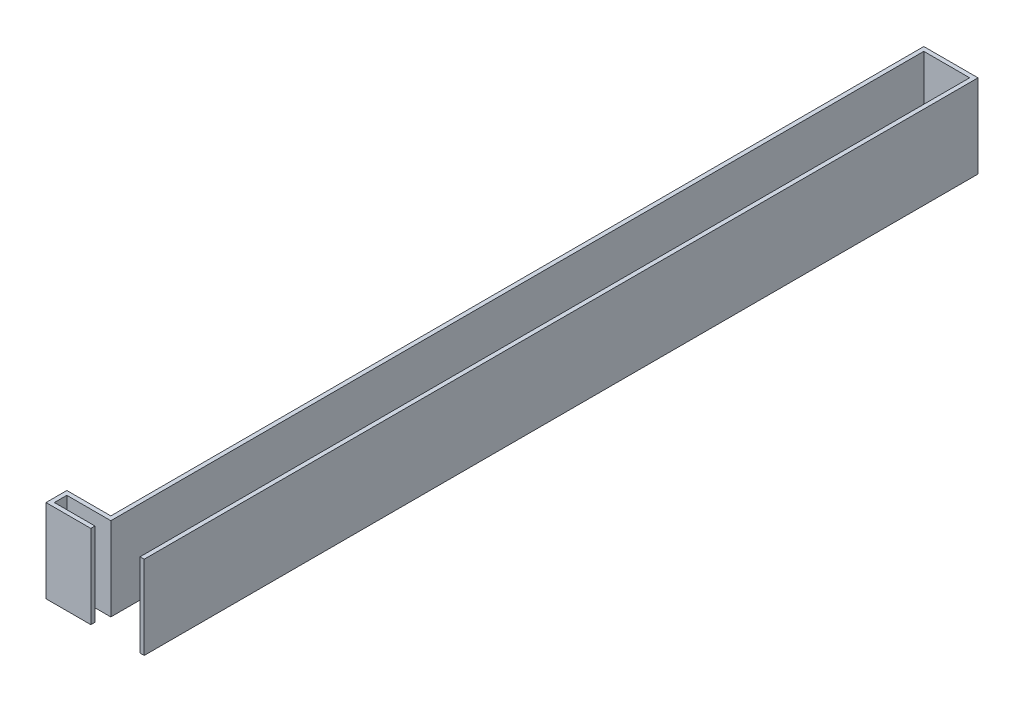
ISO-10303-21;
HEADER;
FILE_DESCRIPTION(('STEP AP214'),'2;1');
FILE_NAME('part.step','',(''),(''),'','','');
FILE_SCHEMA(('AUTOMOTIVE_DESIGN { 1 0 10303 214 1 1 1 1 }'));
ENDSEC;
DATA;
#1=APPLICATION_CONTEXT('core data for automotive mechanical design processes');
#2=APPLICATION_PROTOCOL_DEFINITION('international standard','automotive_design',2000,#1);
#3=PRODUCT_CONTEXT('',#1,'mechanical');
#4=PRODUCT('Part','Part','',(#3));
#5=PRODUCT_RELATED_PRODUCT_CATEGORY('part','',(#4));
#6=PRODUCT_DEFINITION_FORMATION('','',#4);
#7=PRODUCT_DEFINITION_CONTEXT('part definition',#1,'design');
#8=PRODUCT_DEFINITION('design','',#6,#7);
#9=PRODUCT_DEFINITION_SHAPE('','',#8);
#10=(LENGTH_UNIT() NAMED_UNIT(*) SI_UNIT(.MILLI.,.METRE.));
#11=(NAMED_UNIT(*) PLANE_ANGLE_UNIT() SI_UNIT($,.RADIAN.));
#12=(NAMED_UNIT(*) SI_UNIT($,.STERADIAN.) SOLID_ANGLE_UNIT());
#13=UNCERTAINTY_MEASURE_WITH_UNIT(LENGTH_MEASURE(1.E-05),#10,'distance_accuracy_value','');
#14=(GEOMETRIC_REPRESENTATION_CONTEXT(3) GLOBAL_UNCERTAINTY_ASSIGNED_CONTEXT((#13)) GLOBAL_UNIT_ASSIGNED_CONTEXT((#10,
#11,#12)) REPRESENTATION_CONTEXT('',''));
#15=CARTESIAN_POINT('',(0.,0.,0.));
#16=DIRECTION('',(0.,0.,1.));
#17=DIRECTION('',(1.,0.,0.));
#18=AXIS2_PLACEMENT_3D('',#15,#16,#17);
#19=CARTESIAN_POINT('',(-9.99999999999975,200.,0.));
#20=DIRECTION('',(0.,0.,-1.));
#21=DIRECTION('',(-1.,0.,0.));
#22=AXIS2_PLACEMENT_3D('',#19,#20,#21);
#23=PLANE('',#22);
#24=DIRECTION('',(1.,0.,0.));
#25=VECTOR('',#24,1.);
#26=CARTESIAN_POINT('',(-9.99999999999975,0.,0.));
#27=LINE('',#26,#25);
#28=CARTESIAN_POINT('',(-9.99999999999975,0.,0.));
#29=VERTEX_POINT('',#28);
#30=CARTESIAN_POINT('',(0.,0.,0.));
#31=VERTEX_POINT('',#30);
#32=EDGE_CURVE('E170',#29,#31,#27,.T.);
#33=ORIENTED_EDGE('',*,*,#32,.T.);
#34=DIRECTION('',(0.,-1.,0.));
#35=VECTOR('',#34,1.);
#36=CARTESIAN_POINT('',(0.,200.,0.));
#37=LINE('',#36,#35);
#38=CARTESIAN_POINT('',(0.,200.,0.));
#39=VERTEX_POINT('',#38);
#40=EDGE_CURVE('E11',#39,#31,#37,.T.);
#41=ORIENTED_EDGE('',*,*,#40,.F.);
#42=DIRECTION('',(1.,0.,0.));
#43=VECTOR('',#42,1.);
#44=CARTESIAN_POINT('',(-9.99999999999975,200.,0.));
#45=LINE('',#44,#43);
#46=CARTESIAN_POINT('',(-9.99999999999975,200.,0.));
#47=VERTEX_POINT('',#46);
#48=EDGE_CURVE('E198',#47,#39,#45,.T.);
#49=ORIENTED_EDGE('',*,*,#48,.F.);
#50=DIRECTION('',(0.,-1.,0.));
#51=VECTOR('',#50,1.);
#52=CARTESIAN_POINT('',(-9.99999999999975,200.,0.));
#53=LINE('',#52,#51);
#54=EDGE_CURVE('E166',#47,#29,#53,.T.);
#55=ORIENTED_EDGE('',*,*,#54,.T.);
#56=EDGE_LOOP('',(#33,#41,#49,#55));
#57=FACE_BOUND('',#56,.T.);
#58=ADVANCED_FACE('F37',(#57),#23,.F.);
#59=CARTESIAN_POINT('',(0.,200.,0.));
#60=DIRECTION('',(-1.,0.,0.));
#61=DIRECTION('',(0.,0.,1.));
#62=AXIS2_PLACEMENT_3D('',#59,#60,#61);
#63=PLANE('',#62);
#64=DIRECTION('',(0.,0.,-1.));
#65=VECTOR('',#64,1.);
#66=CARTESIAN_POINT('',(0.,0.,0.));
#67=LINE('',#66,#65);
#68=CARTESIAN_POINT('',(0.,0.,-2000.));
#69=VERTEX_POINT('',#68);
#70=EDGE_CURVE('E173',#31,#69,#67,.T.);
#71=ORIENTED_EDGE('',*,*,#70,.T.);
#72=DIRECTION('',(0.,-1.,0.));
#73=VECTOR('',#72,1.);
#74=CARTESIAN_POINT('',(0.,200.,-2000.));
#75=LINE('',#74,#73);
#76=CARTESIAN_POINT('',(0.,200.,-2000.));
#77=VERTEX_POINT('',#76);
#78=EDGE_CURVE('E45',#77,#69,#75,.T.);
#79=ORIENTED_EDGE('',*,*,#78,.F.);
#80=DIRECTION('',(0.,0.,-1.));
#81=VECTOR('',#80,1.);
#82=CARTESIAN_POINT('',(0.,200.,0.));
#83=LINE('',#82,#81);
#84=EDGE_CURVE('E112',#39,#77,#83,.T.);
#85=ORIENTED_EDGE('',*,*,#84,.F.);
#86=ORIENTED_EDGE('',*,*,#40,.T.);
#87=EDGE_LOOP('',(#71,#79,#85,#86));
#88=FACE_BOUND('',#87,.T.);
#89=ADVANCED_FACE('F275',(#88),#63,.F.);
#90=CARTESIAN_POINT('',(0.,200.,-2000.));
#91=DIRECTION('',(0.,0.,1.));
#92=DIRECTION('',(1.,0.,0.));
#93=AXIS2_PLACEMENT_3D('',#90,#91,#92);
#94=PLANE('',#93);
#95=DIRECTION('',(-1.,0.,0.));
#96=VECTOR('',#95,1.);
#97=CARTESIAN_POINT('',(0.,0.,-2000.));
#98=LINE('',#97,#96);
#99=CARTESIAN_POINT('',(-130.,0.,-2000.));
#100=VERTEX_POINT('',#99);
#101=EDGE_CURVE('E175',#69,#100,#98,.T.);
#102=ORIENTED_EDGE('',*,*,#101,.T.);
#103=DIRECTION('',(0.,-1.,0.));
#104=VECTOR('',#103,1.);
#105=CARTESIAN_POINT('',(-130.,200.,-2000.));
#106=LINE('',#105,#104);
#107=CARTESIAN_POINT('',(-130.,200.,-2000.));
#108=VERTEX_POINT('',#107);
#109=EDGE_CURVE('E223',#108,#100,#106,.T.);
#110=ORIENTED_EDGE('',*,*,#109,.F.);
#111=DIRECTION('',(-1.,0.,0.));
#112=VECTOR('',#111,1.);
#113=CARTESIAN_POINT('',(0.,200.,-2000.));
#114=LINE('',#113,#112);
#115=EDGE_CURVE('E231',#77,#108,#114,.T.);
#116=ORIENTED_EDGE('',*,*,#115,.F.);
#117=ORIENTED_EDGE('',*,*,#78,.T.);
#118=EDGE_LOOP('',(#102,#110,#116,#117));
#119=FACE_BOUND('',#118,.T.);
#120=ADVANCED_FACE('F229',(#119),#94,.F.);
#121=CARTESIAN_POINT('',(-130.,200.,-2000.));
#122=DIRECTION('',(1.,0.,0.));
#123=DIRECTION('',(0.,0.,-1.));
#124=AXIS2_PLACEMENT_3D('',#121,#122,#123);
#125=PLANE('',#124);
#126=DIRECTION('',(0.,0.,1.));
#127=VECTOR('',#126,1.);
#128=CARTESIAN_POINT('',(-130.,0.,-2000.));
#129=LINE('',#128,#127);
#130=CARTESIAN_POINT('',(-130.,0.,-50.));
#131=VERTEX_POINT('',#130);
#132=EDGE_CURVE('E177',#100,#131,#129,.T.);
#133=ORIENTED_EDGE('',*,*,#132,.T.);
#134=DIRECTION('',(0.,-1.,0.));
#135=VECTOR('',#134,1.);
#136=CARTESIAN_POINT('',(-130.,200.,-50.));
#137=LINE('',#136,#135);
#138=CARTESIAN_POINT('',(-130.,200.,-50.));
#139=VERTEX_POINT('',#138);
#140=EDGE_CURVE('E220',#139,#131,#137,.T.);
#141=ORIENTED_EDGE('',*,*,#140,.F.);
#142=DIRECTION('',(0.,0.,1.));
#143=VECTOR('',#142,1.);
#144=CARTESIAN_POINT('',(-130.,200.,-2000.));
#145=LINE('',#144,#143);
#146=EDGE_CURVE('E246',#108,#139,#145,.T.);
#147=ORIENTED_EDGE('',*,*,#146,.F.);
#148=ORIENTED_EDGE('',*,*,#109,.T.);
#149=EDGE_LOOP('',(#133,#141,#147,#148));
#150=FACE_BOUND('',#149,.T.);
#151=ADVANCED_FACE('F237',(#150),#125,.F.);
#152=CARTESIAN_POINT('',(-130.,200.,-50.));
#153=DIRECTION('',(0.,0.,1.));
#154=DIRECTION('',(1.,0.,0.));
#155=AXIS2_PLACEMENT_3D('',#152,#153,#154);
#156=PLANE('',#155);
#157=DIRECTION('',(-1.,0.,0.));
#158=VECTOR('',#157,1.);
#159=CARTESIAN_POINT('',(-130.,0.,-50.));
#160=LINE('',#159,#158);
#161=CARTESIAN_POINT('',(-235.5,0.,-50.));
#162=VERTEX_POINT('',#161);
#163=EDGE_CURVE('E179',#131,#162,#160,.T.);
#164=ORIENTED_EDGE('',*,*,#163,.T.);
#165=DIRECTION('',(0.,-1.,0.));
#166=VECTOR('',#165,1.);
#167=CARTESIAN_POINT('',(-235.5,200.,-50.));
#168=LINE('',#167,#166);
#169=CARTESIAN_POINT('',(-235.5,200.,-50.));
#170=VERTEX_POINT('',#169);
#171=EDGE_CURVE('E217',#170,#162,#168,.T.);
#172=ORIENTED_EDGE('',*,*,#171,.F.);
#173=DIRECTION('',(-1.,0.,0.));
#174=VECTOR('',#173,1.);
#175=CARTESIAN_POINT('',(-130.,200.,-50.));
#176=LINE('',#175,#174);
#177=EDGE_CURVE('E243',#139,#170,#176,.T.);
#178=ORIENTED_EDGE('',*,*,#177,.F.);
#179=ORIENTED_EDGE('',*,*,#140,.T.);
#180=EDGE_LOOP('',(#164,#172,#178,#179));
#181=FACE_BOUND('',#180,.T.);
#182=ADVANCED_FACE('F241',(#181),#156,.F.);
#183=CARTESIAN_POINT('',(-235.5,200.,-10.));
#184=DIRECTION('',(1.,0.,0.));
#185=DIRECTION('',(0.,0.,-1.));
#186=AXIS2_PLACEMENT_3D('',#183,#184,#185);
#187=PLANE('',#186);
#188=DIRECTION('',(0.,0.,1.));
#189=VECTOR('',#188,1.);
#190=CARTESIAN_POINT('',(-235.5,0.,-10.));
#191=LINE('',#190,#189);
#192=CARTESIAN_POINT('',(-235.5,0.,0.));
#193=VERTEX_POINT('',#192);
#194=EDGE_CURVE('E182',#162,#193,#191,.T.);
#195=ORIENTED_EDGE('',*,*,#194,.T.);
#196=DIRECTION('',(0.,-1.,0.));
#197=VECTOR('',#196,1.);
#198=CARTESIAN_POINT('',(-235.5,200.,0.));
#199=LINE('',#198,#197);
#200=CARTESIAN_POINT('',(-235.5,200.,0.));
#201=VERTEX_POINT('',#200);
#202=EDGE_CURVE('E214',#201,#193,#199,.T.);
#203=ORIENTED_EDGE('',*,*,#202,.F.);
#204=DIRECTION('',(0.,0.,1.));
#205=VECTOR('',#204,1.);
#206=CARTESIAN_POINT('',(-235.5,200.,-50.));
#207=LINE('',#206,#205);
#208=EDGE_CURVE('E245',#170,#201,#207,.T.);
#209=ORIENTED_EDGE('',*,*,#208,.F.);
#210=ORIENTED_EDGE('',*,*,#171,.T.);
#211=EDGE_LOOP('',(#195,#203,#209,#210));
#212=FACE_BOUND('',#211,.T.);
#213=ADVANCED_FACE('F287',(#212),#187,.F.);
#214=CARTESIAN_POINT('',(-235.5,200.,0.));
#215=DIRECTION('',(0.,0.,-1.));
#216=DIRECTION('',(-1.,0.,0.));
#217=AXIS2_PLACEMENT_3D('',#214,#215,#216);
#218=PLANE('',#217);
#219=DIRECTION('',(1.,0.,0.));
#220=VECTOR('',#219,1.);
#221=CARTESIAN_POINT('',(-235.5,0.,0.));
#222=LINE('',#221,#220);
#223=CARTESIAN_POINT('',(-128.,0.,0.));
#224=VERTEX_POINT('',#223);
#225=EDGE_CURVE('E184',#193,#224,#222,.T.);
#226=ORIENTED_EDGE('',*,*,#225,.T.);
#227=DIRECTION('',(0.,-1.,0.));
#228=VECTOR('',#227,1.);
#229=CARTESIAN_POINT('',(-128.,200.,0.));
#230=LINE('',#229,#228);
#231=CARTESIAN_POINT('',(-128.,200.,0.));
#232=VERTEX_POINT('',#231);
#233=EDGE_CURVE('E211',#232,#224,#230,.T.);
#234=ORIENTED_EDGE('',*,*,#233,.F.);
#235=DIRECTION('',(1.,0.,0.));
#236=VECTOR('',#235,1.);
#237=CARTESIAN_POINT('',(-235.5,200.,0.));
#238=LINE('',#237,#236);
#239=EDGE_CURVE('E248',#201,#232,#238,.T.);
#240=ORIENTED_EDGE('',*,*,#239,.F.);
#241=ORIENTED_EDGE('',*,*,#202,.T.);
#242=EDGE_LOOP('',(#226,#234,#240,#241));
#243=FACE_BOUND('',#242,.T.);
#244=ADVANCED_FACE('F290',(#243),#218,.F.);
#245=CARTESIAN_POINT('',(-128.,200.,-10.));
#246=DIRECTION('',(-1.,0.,0.));
#247=DIRECTION('',(0.,0.,1.));
#248=AXIS2_PLACEMENT_3D('',#245,#246,#247);
#249=PLANE('',#248);
#250=DIRECTION('',(0.,0.,-1.));
#251=VECTOR('',#250,1.);
#252=CARTESIAN_POINT('',(-128.,0.,-10.));
#253=LINE('',#252,#251);
#254=CARTESIAN_POINT('',(-128.,0.,-10.));
#255=VERTEX_POINT('',#254);
#256=EDGE_CURVE('E186',#224,#255,#253,.T.);
#257=ORIENTED_EDGE('',*,*,#256,.T.);
#258=DIRECTION('',(0.,-1.,0.));
#259=VECTOR('',#258,1.);
#260=CARTESIAN_POINT('',(-128.,200.,-10.));
#261=LINE('',#260,#259);
#262=CARTESIAN_POINT('',(-128.,200.,-10.));
#263=VERTEX_POINT('',#262);
#264=EDGE_CURVE('E208',#263,#255,#261,.T.);
#265=ORIENTED_EDGE('',*,*,#264,.F.);
#266=DIRECTION('',(0.,0.,-1.));
#267=VECTOR('',#266,1.);
#268=CARTESIAN_POINT('',(-128.,200.,-10.));
#269=LINE('',#268,#267);
#270=EDGE_CURVE('E254',#232,#263,#269,.T.);
#271=ORIENTED_EDGE('',*,*,#270,.F.);
#272=ORIENTED_EDGE('',*,*,#233,.T.);
#273=EDGE_LOOP('',(#257,#265,#271,#272));
#274=FACE_BOUND('',#273,.T.);
#275=ADVANCED_FACE('F294',(#274),#249,.F.);
#276=CARTESIAN_POINT('',(-128.,200.,-10.));
#277=DIRECTION('',(0.,0.,1.));
#278=DIRECTION('',(1.,0.,0.));
#279=AXIS2_PLACEMENT_3D('',#276,#277,#278);
#280=PLANE('',#279);
#281=DIRECTION('',(-1.,0.,0.));
#282=VECTOR('',#281,1.);
#283=CARTESIAN_POINT('',(-128.,0.,-10.));
#284=LINE('',#283,#282);
#285=CARTESIAN_POINT('',(-225.5,0.,-9.99999999999999));
#286=VERTEX_POINT('',#285);
#287=EDGE_CURVE('E188',#255,#286,#284,.T.);
#288=ORIENTED_EDGE('',*,*,#287,.T.);
#289=DIRECTION('',(0.,-1.,0.));
#290=VECTOR('',#289,1.);
#291=CARTESIAN_POINT('',(-225.5,200.,-9.99999999999999));
#292=LINE('',#291,#290);
#293=CARTESIAN_POINT('',(-225.5,200.,-9.99999999999999));
#294=VERTEX_POINT('',#293);
#295=EDGE_CURVE('E205',#294,#286,#292,.T.);
#296=ORIENTED_EDGE('',*,*,#295,.F.);
#297=DIRECTION('',(-1.,0.,0.));
#298=VECTOR('',#297,1.);
#299=CARTESIAN_POINT('',(-128.,200.,-10.));
#300=LINE('',#299,#298);
#301=EDGE_CURVE('E256',#263,#294,#300,.T.);
#302=ORIENTED_EDGE('',*,*,#301,.F.);
#303=ORIENTED_EDGE('',*,*,#264,.T.);
#304=EDGE_LOOP('',(#288,#296,#302,#303));
#305=FACE_BOUND('',#304,.T.);
#306=ADVANCED_FACE('F298',(#305),#280,.F.);
#307=CARTESIAN_POINT('',(-225.5,200.,-40.));
#308=DIRECTION('',(-1.,0.,0.));
#309=DIRECTION('',(0.,0.,1.));
#310=AXIS2_PLACEMENT_3D('',#307,#308,#309);
#311=PLANE('',#310);
#312=DIRECTION('',(0.,0.,-1.));
#313=VECTOR('',#312,1.);
#314=CARTESIAN_POINT('',(-225.5,0.,-40.));
#315=LINE('',#314,#313);
#316=CARTESIAN_POINT('',(-225.5,0.,-40.));
#317=VERTEX_POINT('',#316);
#318=EDGE_CURVE('E190',#286,#317,#315,.T.);
#319=ORIENTED_EDGE('',*,*,#318,.T.);
#320=DIRECTION('',(0.,-1.,0.));
#321=VECTOR('',#320,1.);
#322=CARTESIAN_POINT('',(-225.5,200.,-40.));
#323=LINE('',#322,#321);
#324=CARTESIAN_POINT('',(-225.5,200.,-40.));
#325=VERTEX_POINT('',#324);
#326=EDGE_CURVE('E202',#325,#317,#323,.T.);
#327=ORIENTED_EDGE('',*,*,#326,.F.);
#328=DIRECTION('',(0.,0.,-1.));
#329=VECTOR('',#328,1.);
#330=CARTESIAN_POINT('',(-225.5,200.,-40.));
#331=LINE('',#330,#329);
#332=EDGE_CURVE('E258',#294,#325,#331,.T.);
#333=ORIENTED_EDGE('',*,*,#332,.F.);
#334=ORIENTED_EDGE('',*,*,#295,.T.);
#335=EDGE_LOOP('',(#319,#327,#333,#334));
#336=FACE_BOUND('',#335,.T.);
#337=ADVANCED_FACE('F264',(#336),#311,.F.);
#338=CARTESIAN_POINT('',(-225.5,200.,-40.));
#339=DIRECTION('',(0.,0.,-1.));
#340=DIRECTION('',(-1.,0.,0.));
#341=AXIS2_PLACEMENT_3D('',#338,#339,#340);
#342=PLANE('',#341);
#343=DIRECTION('',(1.,0.,0.));
#344=VECTOR('',#343,1.);
#345=CARTESIAN_POINT('',(-225.5,0.,-40.));
#346=LINE('',#345,#344);
#347=CARTESIAN_POINT('',(-120.,0.,-40.));
#348=VERTEX_POINT('',#347);
#349=EDGE_CURVE('E192',#317,#348,#346,.T.);
#350=ORIENTED_EDGE('',*,*,#349,.T.);
#351=DIRECTION('',(0.,-1.,0.));
#352=VECTOR('',#351,1.);
#353=CARTESIAN_POINT('',(-120.,200.,-40.));
#354=LINE('',#353,#352);
#355=CARTESIAN_POINT('',(-120.,200.,-40.));
#356=VERTEX_POINT('',#355);
#357=EDGE_CURVE('E161',#356,#348,#354,.T.);
#358=ORIENTED_EDGE('',*,*,#357,.F.);
#359=DIRECTION('',(1.,0.,0.));
#360=VECTOR('',#359,1.);
#361=CARTESIAN_POINT('',(-225.5,200.,-40.));
#362=LINE('',#361,#360);
#363=EDGE_CURVE('E150',#325,#356,#362,.T.);
#364=ORIENTED_EDGE('',*,*,#363,.F.);
#365=ORIENTED_EDGE('',*,*,#326,.T.);
#366=EDGE_LOOP('',(#350,#358,#364,#365));
#367=FACE_BOUND('',#366,.T.);
#368=ADVANCED_FACE('F268',(#367),#342,.F.);
#369=CARTESIAN_POINT('',(-120.,200.,-40.));
#370=DIRECTION('',(-1.,0.,0.));
#371=DIRECTION('',(0.,0.,1.));
#372=AXIS2_PLACEMENT_3D('',#369,#370,#371);
#373=PLANE('',#372);
#374=DIRECTION('',(0.,0.,-1.));
#375=VECTOR('',#374,1.);
#376=CARTESIAN_POINT('',(-120.,0.,-40.));
#377=LINE('',#376,#375);
#378=CARTESIAN_POINT('',(-120.,0.,-1990.));
#379=VERTEX_POINT('',#378);
#380=EDGE_CURVE('E159',#348,#379,#377,.T.);
#381=ORIENTED_EDGE('',*,*,#380,.T.);
#382=DIRECTION('',(0.,-1.,0.));
#383=VECTOR('',#382,1.);
#384=CARTESIAN_POINT('',(-120.,200.,-1990.));
#385=LINE('',#384,#383);
#386=CARTESIAN_POINT('',(-120.,200.,-1990.));
#387=VERTEX_POINT('',#386);
#388=EDGE_CURVE('E156',#387,#379,#385,.T.);
#389=ORIENTED_EDGE('',*,*,#388,.F.);
#390=DIRECTION('',(0.,0.,-1.));
#391=VECTOR('',#390,1.);
#392=CARTESIAN_POINT('',(-120.,200.,-40.));
#393=LINE('',#392,#391);
#394=EDGE_CURVE('E143',#356,#387,#393,.T.);
#395=ORIENTED_EDGE('',*,*,#394,.F.);
#396=ORIENTED_EDGE('',*,*,#357,.T.);
#397=EDGE_LOOP('',(#381,#389,#395,#396));
#398=FACE_BOUND('',#397,.T.);
#399=ADVANCED_FACE('F157',(#398),#373,.F.);
#400=CARTESIAN_POINT('',(-120.,200.,-1990.));
#401=DIRECTION('',(0.,0.,-1.));
#402=DIRECTION('',(-1.,0.,0.));
#403=AXIS2_PLACEMENT_3D('',#400,#401,#402);
#404=PLANE('',#403);
#405=DIRECTION('',(1.,0.,0.));
#406=VECTOR('',#405,1.);
#407=CARTESIAN_POINT('',(-120.,0.,-1990.));
#408=LINE('',#407,#406);
#409=CARTESIAN_POINT('',(-10.,0.,-1990.));
#410=VERTEX_POINT('',#409);
#411=EDGE_CURVE('E195',#379,#410,#408,.T.);
#412=ORIENTED_EDGE('',*,*,#411,.T.);
#413=DIRECTION('',(0.,-1.,0.));
#414=VECTOR('',#413,1.);
#415=CARTESIAN_POINT('',(-10.,200.,-1990.));
#416=LINE('',#415,#414);
#417=CARTESIAN_POINT('',(-10.,200.,-1990.));
#418=VERTEX_POINT('',#417);
#419=EDGE_CURVE('E162',#418,#410,#416,.T.);
#420=ORIENTED_EDGE('',*,*,#419,.F.);
#421=DIRECTION('',(1.,0.,0.));
#422=VECTOR('',#421,1.);
#423=CARTESIAN_POINT('',(-120.,200.,-1990.));
#424=LINE('',#423,#422);
#425=EDGE_CURVE('E147',#387,#418,#424,.T.);
#426=ORIENTED_EDGE('',*,*,#425,.F.);
#427=ORIENTED_EDGE('',*,*,#388,.T.);
#428=EDGE_LOOP('',(#412,#420,#426,#427));
#429=FACE_BOUND('',#428,.T.);
#430=ADVANCED_FACE('F164',(#429),#404,.F.);
#431=CARTESIAN_POINT('',(-9.99999999999975,200.,-2.));
#432=DIRECTION('',(1.,0.,0.));
#433=DIRECTION('',(0.,0.,-1.));
#434=AXIS2_PLACEMENT_3D('',#431,#432,#433);
#435=PLANE('',#434);
#436=DIRECTION('',(0.,0.,1.));
#437=VECTOR('',#436,1.);
#438=CARTESIAN_POINT('',(-9.99999999999975,0.,-2.));
#439=LINE('',#438,#437);
#440=EDGE_CURVE('E100',#410,#29,#439,.T.);
#441=ORIENTED_EDGE('',*,*,#440,.T.);
#442=ORIENTED_EDGE('',*,*,#54,.F.);
#443=DIRECTION('',(0.,0.,1.));
#444=VECTOR('',#443,1.);
#445=CARTESIAN_POINT('',(-10.,200.,-1990.));
#446=LINE('',#445,#444);
#447=EDGE_CURVE('E53',#418,#47,#446,.T.);
#448=ORIENTED_EDGE('',*,*,#447,.F.);
#449=ORIENTED_EDGE('',*,*,#419,.T.);
#450=EDGE_LOOP('',(#441,#442,#448,#449));
#451=FACE_BOUND('',#450,.T.);
#452=ADVANCED_FACE('F269',(#451),#435,.F.);
#453=CARTESIAN_POINT('',(0.,200.,0.));
#454=DIRECTION('',(0.,1.,0.));
#455=DIRECTION('',(0.,0.,1.));
#456=AXIS2_PLACEMENT_3D('',#453,#454,#455);
#457=PLANE('',#456);
#458=ORIENTED_EDGE('',*,*,#48,.T.);
#459=ORIENTED_EDGE('',*,*,#84,.T.);
#460=ORIENTED_EDGE('',*,*,#115,.T.);
#461=ORIENTED_EDGE('',*,*,#146,.T.);
#462=ORIENTED_EDGE('',*,*,#177,.T.);
#463=ORIENTED_EDGE('',*,*,#208,.T.);
#464=ORIENTED_EDGE('',*,*,#239,.T.);
#465=ORIENTED_EDGE('',*,*,#270,.T.);
#466=ORIENTED_EDGE('',*,*,#301,.T.);
#467=ORIENTED_EDGE('',*,*,#332,.T.);
#468=ORIENTED_EDGE('',*,*,#363,.T.);
#469=ORIENTED_EDGE('',*,*,#394,.T.);
#470=ORIENTED_EDGE('',*,*,#425,.T.);
#471=ORIENTED_EDGE('',*,*,#447,.T.);
#472=EDGE_LOOP('',(#458,#459,#460,#461,#462,#463,#464,#465,#466,#467,#468,#469,#470,#471));
#473=FACE_BOUND('',#472,.T.);
#474=ADVANCED_FACE('F145',(#473),#457,.T.);
#475=CARTESIAN_POINT('',(0.,0.,0.));
#476=DIRECTION('',(0.,1.,0.));
#477=DIRECTION('',(0.,0.,1.));
#478=AXIS2_PLACEMENT_3D('',#475,#476,#477);
#479=PLANE('',#478);
#480=ORIENTED_EDGE('',*,*,#32,.F.);
#481=ORIENTED_EDGE('',*,*,#440,.F.);
#482=ORIENTED_EDGE('',*,*,#411,.F.);
#483=ORIENTED_EDGE('',*,*,#380,.F.);
#484=ORIENTED_EDGE('',*,*,#349,.F.);
#485=ORIENTED_EDGE('',*,*,#318,.F.);
#486=ORIENTED_EDGE('',*,*,#287,.F.);
#487=ORIENTED_EDGE('',*,*,#256,.F.);
#488=ORIENTED_EDGE('',*,*,#225,.F.);
#489=ORIENTED_EDGE('',*,*,#194,.F.);
#490=ORIENTED_EDGE('',*,*,#163,.F.);
#491=ORIENTED_EDGE('',*,*,#132,.F.);
#492=ORIENTED_EDGE('',*,*,#101,.F.);
#493=ORIENTED_EDGE('',*,*,#70,.F.);
#494=EDGE_LOOP('',(#480,#481,#482,#483,#484,#485,#486,#487,#488,#489,#490,#491,#492,#493));
#495=FACE_BOUND('',#494,.T.);
#496=ADVANCED_FACE('F233',(#495),#479,.F.);
#497=CLOSED_SHELL('',(#58,#89,#120,#151,#182,#213,#244,#275,#306,#337,#368,#399,#430,#452,#474,#496));
#498=MANIFOLD_SOLID_BREP('B2',#497);
#499=ADVANCED_BREP_SHAPE_REPRESENTATION('',(#18,#498),#14);
#500=SHAPE_DEFINITION_REPRESENTATION(#9,#499);
ENDSEC;
END-ISO-10303-21;
